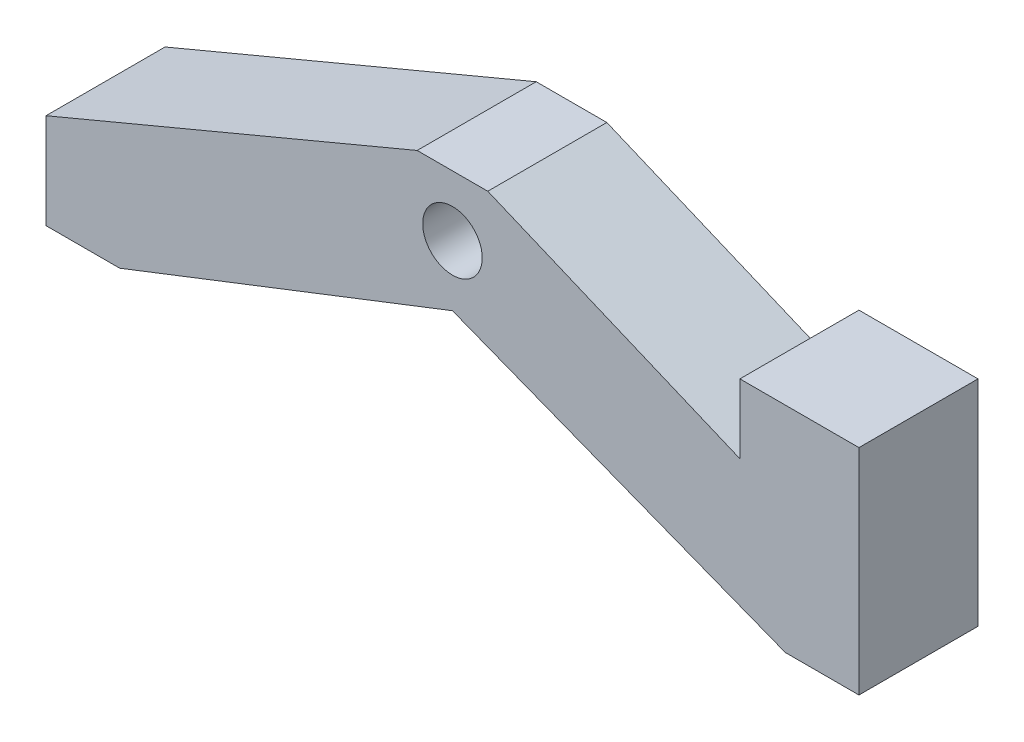
ISO-10303-21;
HEADER;
FILE_DESCRIPTION(('STEP AP214'),'2;1');
FILE_NAME('part.step','',(''),(''),'','','');
FILE_SCHEMA(('AUTOMOTIVE_DESIGN { 1 0 10303 214 1 1 1 1 }'));
ENDSEC;
DATA;
#1=APPLICATION_CONTEXT('core data for automotive mechanical design processes');
#2=APPLICATION_PROTOCOL_DEFINITION('international standard','automotive_design',2000,#1);
#3=PRODUCT_CONTEXT('',#1,'mechanical');
#4=PRODUCT('Part','Part','',(#3));
#5=PRODUCT_RELATED_PRODUCT_CATEGORY('part','',(#4));
#6=PRODUCT_DEFINITION_FORMATION('','',#4);
#7=PRODUCT_DEFINITION_CONTEXT('part definition',#1,'design');
#8=PRODUCT_DEFINITION('design','',#6,#7);
#9=PRODUCT_DEFINITION_SHAPE('','',#8);
#10=(LENGTH_UNIT() NAMED_UNIT(*) SI_UNIT(.MILLI.,.METRE.));
#11=(NAMED_UNIT(*) PLANE_ANGLE_UNIT() SI_UNIT($,.RADIAN.));
#12=(NAMED_UNIT(*) SI_UNIT($,.STERADIAN.) SOLID_ANGLE_UNIT());
#13=UNCERTAINTY_MEASURE_WITH_UNIT(LENGTH_MEASURE(1.E-05),#10,'distance_accuracy_value','');
#14=(GEOMETRIC_REPRESENTATION_CONTEXT(3) GLOBAL_UNCERTAINTY_ASSIGNED_CONTEXT((#13)) GLOBAL_UNIT_ASSIGNED_CONTEXT((#10,
#11,#12)) REPRESENTATION_CONTEXT('',''));
#15=CARTESIAN_POINT('',(0.,0.,0.));
#16=DIRECTION('',(0.,0.,1.));
#17=DIRECTION('',(1.,0.,0.));
#18=AXIS2_PLACEMENT_3D('',#15,#16,#17);
#19=CARTESIAN_POINT('',(34.1438780120931,-2.88405172877399,5.));
#20=DIRECTION('',(-0.386383553202414,-0.922338197091868,0.));
#21=DIRECTION('',(0.922338197091868,-0.386383553202414,0.));
#22=AXIS2_PLACEMENT_3D('',#19,#20,#21);
#23=PLANE('',#22);
#24=DIRECTION('',(0.,0.,1.));
#25=VECTOR('',#24,1.);
#26=CARTESIAN_POINT('',(24.1438780120931,1.30512263720891,-5.));
#27=LINE('',#26,#25);
#28=CARTESIAN_POINT('',(24.1438780120931,1.30512263720891,-5.));
#29=VERTEX_POINT('',#28);
#30=CARTESIAN_POINT('',(24.1438780120931,1.30512263720891,5.));
#31=VERTEX_POINT('',#30);
#32=EDGE_CURVE('E77',#29,#31,#27,.T.);
#33=ORIENTED_EDGE('',*,*,#32,.F.);
#34=DIRECTION('',(-0.922338197091868,0.386383553202414,0.));
#35=VECTOR('',#34,1.);
#36=CARTESIAN_POINT('',(34.1438780120931,-2.88405172877399,-5.));
#37=LINE('',#36,#35);
#38=CARTESIAN_POINT('',(2.96622663641541,10.17681006468,-5.));
#39=VERTEX_POINT('',#38);
#40=EDGE_CURVE('E175',#29,#39,#37,.T.);
#41=ORIENTED_EDGE('',*,*,#40,.T.);
#42=DIRECTION('',(0.,0.,-1.));
#43=VECTOR('',#42,1.);
#44=CARTESIAN_POINT('',(2.96622663641541,10.17681006468,5.));
#45=LINE('',#44,#43);
#46=CARTESIAN_POINT('',(2.96622663641541,10.17681006468,5.));
#47=VERTEX_POINT('',#46);
#48=EDGE_CURVE('E12',#47,#39,#45,.T.);
#49=ORIENTED_EDGE('',*,*,#48,.F.);
#50=DIRECTION('',(-0.922338197091868,0.386383553202414,0.));
#51=VECTOR('',#50,1.);
#52=CARTESIAN_POINT('',(34.1438780120931,-2.88405172877399,5.));
#53=LINE('',#52,#51);
#54=EDGE_CURVE('E125',#31,#47,#53,.T.);
#55=ORIENTED_EDGE('',*,*,#54,.F.);
#56=EDGE_LOOP('',(#33,#41,#49,#55));
#57=FACE_BOUND('',#56,.T.);
#58=ADVANCED_FACE('F63',(#57),#23,.F.);
#59=CARTESIAN_POINT('',(0.,0.,5.));
#60=DIRECTION('',(0.,0.,-1.));
#61=DIRECTION('',(-1.,0.,0.));
#62=AXIS2_PLACEMENT_3D('',#59,#60,#61);
#63=PLANE('',#62);
#64=DIRECTION('',(0.,1.,0.));
#65=VECTOR('',#64,1.);
#66=CARTESIAN_POINT('',(34.1438780120931,-10.884051728774,5.));
#67=LINE('',#66,#65);
#68=CARTESIAN_POINT('',(34.1438780120931,-10.884051728774,5.));
#69=VERTEX_POINT('',#68);
#70=CARTESIAN_POINT('',(34.1438780120931,7.11594827122601,5.));
#71=VERTEX_POINT('',#70);
#72=EDGE_CURVE('E172',#69,#71,#67,.T.);
#73=ORIENTED_EDGE('',*,*,#72,.T.);
#74=DIRECTION('',(-1.,0.,0.));
#75=VECTOR('',#74,1.);
#76=CARTESIAN_POINT('',(24.1438780120931,7.11594827122601,5.));
#77=LINE('',#76,#75);
#78=CARTESIAN_POINT('',(24.1438780120931,7.11594827122601,5.));
#79=VERTEX_POINT('',#78);
#80=EDGE_CURVE('E243',#71,#79,#77,.T.);
#81=ORIENTED_EDGE('',*,*,#80,.T.);
#82=DIRECTION('',(0.,-1.,0.));
#83=VECTOR('',#82,1.);
#84=CARTESIAN_POINT('',(24.1438780120931,1.30512263720891,5.));
#85=LINE('',#84,#83);
#86=EDGE_CURVE('E240',#79,#31,#85,.T.);
#87=ORIENTED_EDGE('',*,*,#86,.T.);
#88=ORIENTED_EDGE('',*,*,#54,.T.);
#89=DIRECTION('',(-1.,0.,0.));
#90=VECTOR('',#89,1.);
#91=CARTESIAN_POINT('',(2.96622663641541,10.17681006468,5.));
#92=LINE('',#91,#90);
#93=CARTESIAN_POINT('',(-2.96622663641544,10.17681006468,5.));
#94=VERTEX_POINT('',#93);
#95=EDGE_CURVE('E222',#47,#94,#92,.T.);
#96=ORIENTED_EDGE('',*,*,#95,.T.);
#97=DIRECTION('',(0.922338197091867,0.386383553202416,0.));
#98=VECTOR('',#97,1.);
#99=CARTESIAN_POINT('',(-34.143878012093,-2.88405172877408,5.));
#100=LINE('',#99,#98);
#101=CARTESIAN_POINT('',(-34.143878012093,-2.88405172877408,5.));
#102=VERTEX_POINT('',#101);
#103=EDGE_CURVE('E209',#102,#94,#100,.T.);
#104=ORIENTED_EDGE('',*,*,#103,.F.);
#105=DIRECTION('',(0.,1.,0.));
#106=VECTOR('',#105,1.);
#107=CARTESIAN_POINT('',(-34.143878012093,-10.8840517287741,5.));
#108=LINE('',#107,#106);
#109=CARTESIAN_POINT('',(-34.143878012093,-10.8840517287741,5.));
#110=VERTEX_POINT('',#109);
#111=EDGE_CURVE('E167',#110,#102,#108,.T.);
#112=ORIENTED_EDGE('',*,*,#111,.F.);
#113=DIRECTION('',(-1.,0.,0.));
#114=VECTOR('',#113,1.);
#115=CARTESIAN_POINT('',(-27.9559907348205,-10.8840517287741,5.));
#116=LINE('',#115,#114);
#117=CARTESIAN_POINT('',(-27.9559907348205,-10.8840517287741,5.));
#118=VERTEX_POINT('',#117);
#119=EDGE_CURVE('E165',#118,#110,#116,.T.);
#120=ORIENTED_EDGE('',*,*,#119,.F.);
#121=DIRECTION('',(-0.93186635782735,-0.362801724292469,0.));
#122=VECTOR('',#121,1.);
#123=CARTESIAN_POINT('',(0.,0.,5.));
#124=LINE('',#123,#122);
#125=CARTESIAN_POINT('',(0.,0.,5.));
#126=VERTEX_POINT('',#125);
#127=EDGE_CURVE('E148',#126,#118,#124,.T.);
#128=ORIENTED_EDGE('',*,*,#127,.F.);
#129=DIRECTION('',(0.931866357827351,-0.362801724292466,0.));
#130=VECTOR('',#129,1.);
#131=CARTESIAN_POINT('',(0.,0.,5.));
#132=LINE('',#131,#130);
#133=CARTESIAN_POINT('',(27.9559907348205,-10.884051728774,5.));
#134=VERTEX_POINT('',#133);
#135=EDGE_CURVE('E157',#126,#134,#132,.T.);
#136=ORIENTED_EDGE('',*,*,#135,.T.);
#137=DIRECTION('',(1.,0.,0.));
#138=VECTOR('',#137,1.);
#139=CARTESIAN_POINT('',(27.9559907348205,-10.884051728774,5.));
#140=LINE('',#139,#138);
#141=EDGE_CURVE('E86',#134,#69,#140,.T.);
#142=ORIENTED_EDGE('',*,*,#141,.T.);
#143=EDGE_LOOP('',(#73,#81,#87,#88,#96,#104,#112,#120,#128,#136,#142));
#144=FACE_BOUND('',#143,.T.);
#145=CARTESIAN_POINT('',(0.,5.08840503234002,5.));
#146=DIRECTION('',(0.,0.,1.));
#147=DIRECTION('',(1.,0.,0.));
#148=AXIS2_PLACEMENT_3D('',#145,#146,#147);
#149=CIRCLE('',#148,2.5);
#150=CARTESIAN_POINT('',(2.49999999999999,5.08840503234002,5.));
#151=VERTEX_POINT('',#150);
#152=EDGE_CURVE('E178',#151,#151,#149,.T.);
#153=ORIENTED_EDGE('',*,*,#152,.F.);
#154=EDGE_LOOP('',(#153));
#155=FACE_BOUND('',#154,.T.);
#156=ADVANCED_FACE('F161',(#144,#155),#63,.F.);
#157=CARTESIAN_POINT('',(0.,0.,-5.));
#158=DIRECTION('',(0.,0.,-1.));
#159=DIRECTION('',(-1.,0.,0.));
#160=AXIS2_PLACEMENT_3D('',#157,#158,#159);
#161=PLANE('',#160);
#162=ORIENTED_EDGE('',*,*,#40,.F.);
#163=DIRECTION('',(0.,-1.,0.));
#164=VECTOR('',#163,1.);
#165=CARTESIAN_POINT('',(24.1438780120931,1.30512263720891,-5.));
#166=LINE('',#165,#164);
#167=CARTESIAN_POINT('',(24.1438780120931,7.11594827122601,-5.));
#168=VERTEX_POINT('',#167);
#169=EDGE_CURVE('E236',#168,#29,#166,.T.);
#170=ORIENTED_EDGE('',*,*,#169,.F.);
#171=DIRECTION('',(-1.,0.,0.));
#172=VECTOR('',#171,1.);
#173=CARTESIAN_POINT('',(24.1438780120931,7.11594827122601,-5.));
#174=LINE('',#173,#172);
#175=CARTESIAN_POINT('',(34.1438780120931,7.11594827122601,-5.));
#176=VERTEX_POINT('',#175);
#177=EDGE_CURVE('E242',#176,#168,#174,.T.);
#178=ORIENTED_EDGE('',*,*,#177,.F.);
#179=DIRECTION('',(0.,1.,0.));
#180=VECTOR('',#179,1.);
#181=CARTESIAN_POINT('',(34.1438780120931,-10.884051728774,-5.));
#182=LINE('',#181,#180);
#183=CARTESIAN_POINT('',(34.1438780120931,-10.884051728774,-5.));
#184=VERTEX_POINT('',#183);
#185=EDGE_CURVE('E194',#184,#176,#182,.T.);
#186=ORIENTED_EDGE('',*,*,#185,.F.);
#187=DIRECTION('',(1.,0.,0.));
#188=VECTOR('',#187,1.);
#189=CARTESIAN_POINT('',(27.9559907348205,-10.884051728774,-5.));
#190=LINE('',#189,#188);
#191=CARTESIAN_POINT('',(27.9559907348205,-10.884051728774,-5.));
#192=VERTEX_POINT('',#191);
#193=EDGE_CURVE('E118',#192,#184,#190,.T.);
#194=ORIENTED_EDGE('',*,*,#193,.F.);
#195=DIRECTION('',(0.931866357827351,-0.362801724292466,0.));
#196=VECTOR('',#195,1.);
#197=CARTESIAN_POINT('',(0.,0.,-5.));
#198=LINE('',#197,#196);
#199=CARTESIAN_POINT('',(0.,0.,-5.));
#200=VERTEX_POINT('',#199);
#201=EDGE_CURVE('E191',#200,#192,#198,.T.);
#202=ORIENTED_EDGE('',*,*,#201,.F.);
#203=DIRECTION('',(-0.93186635782735,-0.362801724292469,0.));
#204=VECTOR('',#203,1.);
#205=CARTESIAN_POINT('',(0.,0.,-5.));
#206=LINE('',#205,#204);
#207=CARTESIAN_POINT('',(-27.9559907348205,-10.8840517287741,-5.));
#208=VERTEX_POINT('',#207);
#209=EDGE_CURVE('E150',#200,#208,#206,.T.);
#210=ORIENTED_EDGE('',*,*,#209,.T.);
#211=DIRECTION('',(-1.,0.,0.));
#212=VECTOR('',#211,1.);
#213=CARTESIAN_POINT('',(-27.9559907348205,-10.8840517287741,-5.));
#214=LINE('',#213,#212);
#215=CARTESIAN_POINT('',(-34.143878012093,-10.8840517287741,-5.));
#216=VERTEX_POINT('',#215);
#217=EDGE_CURVE('E187',#208,#216,#214,.T.);
#218=ORIENTED_EDGE('',*,*,#217,.T.);
#219=DIRECTION('',(0.,1.,0.));
#220=VECTOR('',#219,1.);
#221=CARTESIAN_POINT('',(-34.143878012093,-10.8840517287741,-5.));
#222=LINE('',#221,#220);
#223=CARTESIAN_POINT('',(-34.143878012093,-2.88405172877408,-5.));
#224=VERTEX_POINT('',#223);
#225=EDGE_CURVE('E184',#216,#224,#222,.T.);
#226=ORIENTED_EDGE('',*,*,#225,.T.);
#227=DIRECTION('',(0.922338197091867,0.386383553202416,0.));
#228=VECTOR('',#227,1.);
#229=CARTESIAN_POINT('',(-34.143878012093,-2.88405172877408,-5.));
#230=LINE('',#229,#228);
#231=CARTESIAN_POINT('',(-2.96622663641544,10.17681006468,-5.));
#232=VERTEX_POINT('',#231);
#233=EDGE_CURVE('E181',#224,#232,#230,.T.);
#234=ORIENTED_EDGE('',*,*,#233,.T.);
#235=DIRECTION('',(-1.,0.,0.));
#236=VECTOR('',#235,1.);
#237=CARTESIAN_POINT('',(2.96622663641541,10.17681006468,-5.));
#238=LINE('',#237,#236);
#239=EDGE_CURVE('E177',#39,#232,#238,.T.);
#240=ORIENTED_EDGE('',*,*,#239,.F.);
#241=EDGE_LOOP('',(#162,#170,#178,#186,#194,#202,#210,#218,#226,#234,#240));
#242=FACE_BOUND('',#241,.T.);
#243=CARTESIAN_POINT('',(0.,5.08840503234002,-5.));
#244=DIRECTION('',(0.,0.,1.));
#245=DIRECTION('',(1.,0.,0.));
#246=AXIS2_PLACEMENT_3D('',#243,#244,#245);
#247=CIRCLE('',#246,2.5);
#248=CARTESIAN_POINT('',(2.49999999999999,5.08840503234002,-5.));
#249=VERTEX_POINT('',#248);
#250=EDGE_CURVE('E227',#249,#249,#247,.T.);
#251=ORIENTED_EDGE('',*,*,#250,.T.);
#252=EDGE_LOOP('',(#251));
#253=FACE_BOUND('',#252,.T.);
#254=ADVANCED_FACE('F215',(#242,#253),#161,.T.);
#255=CARTESIAN_POINT('',(2.96622663641541,10.17681006468,5.));
#256=DIRECTION('',(0.,-1.,0.));
#257=DIRECTION('',(1.,0.,0.));
#258=AXIS2_PLACEMENT_3D('',#255,#256,#257);
#259=PLANE('',#258);
#260=ORIENTED_EDGE('',*,*,#239,.T.);
#261=DIRECTION('',(0.,0.,-1.));
#262=VECTOR('',#261,1.);
#263=CARTESIAN_POINT('',(-2.96622663641544,10.17681006468,5.));
#264=LINE('',#263,#262);
#265=EDGE_CURVE('E70',#94,#232,#264,.T.);
#266=ORIENTED_EDGE('',*,*,#265,.F.);
#267=ORIENTED_EDGE('',*,*,#95,.F.);
#268=ORIENTED_EDGE('',*,*,#48,.T.);
#269=EDGE_LOOP('',(#260,#266,#267,#268));
#270=FACE_BOUND('',#269,.T.);
#271=ADVANCED_FACE('F212',(#270),#259,.F.);
#272=CARTESIAN_POINT('',(-34.143878012093,-2.88405172877408,5.));
#273=DIRECTION('',(-0.386383553202416,0.922338197091867,0.));
#274=DIRECTION('',(-0.922338197091867,-0.386383553202416,0.));
#275=AXIS2_PLACEMENT_3D('',#272,#273,#274);
#276=PLANE('',#275);
#277=ORIENTED_EDGE('',*,*,#233,.F.);
#278=DIRECTION('',(0.,0.,-1.));
#279=VECTOR('',#278,1.);
#280=CARTESIAN_POINT('',(-34.143878012093,-2.88405172877408,5.));
#281=LINE('',#280,#279);
#282=EDGE_CURVE('E202',#102,#224,#281,.T.);
#283=ORIENTED_EDGE('',*,*,#282,.F.);
#284=ORIENTED_EDGE('',*,*,#103,.T.);
#285=ORIENTED_EDGE('',*,*,#265,.T.);
#286=EDGE_LOOP('',(#277,#283,#284,#285));
#287=FACE_BOUND('',#286,.T.);
#288=ADVANCED_FACE('F207',(#287),#276,.T.);
#289=CARTESIAN_POINT('',(-34.143878012093,-10.8840517287741,5.));
#290=DIRECTION('',(-1.,0.,0.));
#291=DIRECTION('',(0.,-1.,0.));
#292=AXIS2_PLACEMENT_3D('',#289,#290,#291);
#293=PLANE('',#292);
#294=ORIENTED_EDGE('',*,*,#225,.F.);
#295=DIRECTION('',(0.,0.,-1.));
#296=VECTOR('',#295,1.);
#297=CARTESIAN_POINT('',(-34.143878012093,-10.8840517287741,5.));
#298=LINE('',#297,#296);
#299=EDGE_CURVE('E200',#110,#216,#298,.T.);
#300=ORIENTED_EDGE('',*,*,#299,.F.);
#301=ORIENTED_EDGE('',*,*,#111,.T.);
#302=ORIENTED_EDGE('',*,*,#282,.T.);
#303=EDGE_LOOP('',(#294,#300,#301,#302));
#304=FACE_BOUND('',#303,.T.);
#305=ADVANCED_FACE('F220',(#304),#293,.T.);
#306=CARTESIAN_POINT('',(-27.9559907348205,-10.8840517287741,5.));
#307=DIRECTION('',(0.,-1.,0.));
#308=DIRECTION('',(1.,0.,0.));
#309=AXIS2_PLACEMENT_3D('',#306,#307,#308);
#310=PLANE('',#309);
#311=ORIENTED_EDGE('',*,*,#217,.F.);
#312=DIRECTION('',(0.,0.,-1.));
#313=VECTOR('',#312,1.);
#314=CARTESIAN_POINT('',(-27.9559907348205,-10.8840517287741,5.));
#315=LINE('',#314,#313);
#316=EDGE_CURVE('E153',#118,#208,#315,.T.);
#317=ORIENTED_EDGE('',*,*,#316,.F.);
#318=ORIENTED_EDGE('',*,*,#119,.T.);
#319=ORIENTED_EDGE('',*,*,#299,.T.);
#320=EDGE_LOOP('',(#311,#317,#318,#319));
#321=FACE_BOUND('',#320,.T.);
#322=ADVANCED_FACE('F357',(#321),#310,.T.);
#323=CARTESIAN_POINT('',(0.,0.,5.));
#324=DIRECTION('',(0.362801724292469,-0.93186635782735,0.));
#325=DIRECTION('',(0.93186635782735,0.362801724292469,0.));
#326=AXIS2_PLACEMENT_3D('',#323,#324,#325);
#327=PLANE('',#326);
#328=ORIENTED_EDGE('',*,*,#209,.F.);
#329=DIRECTION('',(0.,0.,-1.));
#330=VECTOR('',#329,1.);
#331=CARTESIAN_POINT('',(0.,0.,5.));
#332=LINE('',#331,#330);
#333=EDGE_CURVE('E144',#126,#200,#332,.T.);
#334=ORIENTED_EDGE('',*,*,#333,.F.);
#335=ORIENTED_EDGE('',*,*,#127,.T.);
#336=ORIENTED_EDGE('',*,*,#316,.T.);
#337=EDGE_LOOP('',(#328,#334,#335,#336));
#338=FACE_BOUND('',#337,.T.);
#339=ADVANCED_FACE('F146',(#338),#327,.T.);
#340=CARTESIAN_POINT('',(0.,0.,5.));
#341=DIRECTION('',(0.362801724292466,0.931866357827351,0.));
#342=DIRECTION('',(-0.931866357827351,0.362801724292466,0.));
#343=AXIS2_PLACEMENT_3D('',#340,#341,#342);
#344=PLANE('',#343);
#345=ORIENTED_EDGE('',*,*,#201,.T.);
#346=DIRECTION('',(0.,0.,-1.));
#347=VECTOR('',#346,1.);
#348=CARTESIAN_POINT('',(27.9559907348205,-10.884051728774,5.));
#349=LINE('',#348,#347);
#350=EDGE_CURVE('E154',#134,#192,#349,.T.);
#351=ORIENTED_EDGE('',*,*,#350,.F.);
#352=ORIENTED_EDGE('',*,*,#135,.F.);
#353=ORIENTED_EDGE('',*,*,#333,.T.);
#354=EDGE_LOOP('',(#345,#351,#352,#353));
#355=FACE_BOUND('',#354,.T.);
#356=ADVANCED_FACE('F158',(#355),#344,.F.);
#357=CARTESIAN_POINT('',(27.9559907348205,-10.884051728774,5.));
#358=DIRECTION('',(0.,1.,0.));
#359=DIRECTION('',(0.,0.,1.));
#360=AXIS2_PLACEMENT_3D('',#357,#358,#359);
#361=PLANE('',#360);
#362=ORIENTED_EDGE('',*,*,#193,.T.);
#363=DIRECTION('',(0.,0.,-1.));
#364=VECTOR('',#363,1.);
#365=CARTESIAN_POINT('',(34.1438780120931,-10.884051728774,5.));
#366=LINE('',#365,#364);
#367=EDGE_CURVE('E174',#69,#184,#366,.T.);
#368=ORIENTED_EDGE('',*,*,#367,.F.);
#369=ORIENTED_EDGE('',*,*,#141,.F.);
#370=ORIENTED_EDGE('',*,*,#350,.T.);
#371=EDGE_LOOP('',(#362,#368,#369,#370));
#372=FACE_BOUND('',#371,.T.);
#373=ADVANCED_FACE('F269',(#372),#361,.F.);
#374=CARTESIAN_POINT('',(34.1438780120931,-10.884051728774,5.));
#375=DIRECTION('',(-1.,0.,0.));
#376=DIRECTION('',(0.,0.,1.));
#377=AXIS2_PLACEMENT_3D('',#374,#375,#376);
#378=PLANE('',#377);
#379=ORIENTED_EDGE('',*,*,#185,.T.);
#380=DIRECTION('',(0.,0.,1.));
#381=VECTOR('',#380,1.);
#382=CARTESIAN_POINT('',(34.1438780120931,7.11594827122601,-5.));
#383=LINE('',#382,#381);
#384=EDGE_CURVE('E232',#176,#71,#383,.T.);
#385=ORIENTED_EDGE('',*,*,#384,.T.);
#386=ORIENTED_EDGE('',*,*,#72,.F.);
#387=ORIENTED_EDGE('',*,*,#367,.T.);
#388=EDGE_LOOP('',(#379,#385,#386,#387));
#389=FACE_BOUND('',#388,.T.);
#390=ADVANCED_FACE('F266',(#389),#378,.F.);
#391=CARTESIAN_POINT('',(0.,5.08840503234002,5.));
#392=DIRECTION('',(0.,0.,-1.));
#393=DIRECTION('',(-1.,0.,0.));
#394=AXIS2_PLACEMENT_3D('',#391,#392,#393);
#395=CYLINDRICAL_SURFACE('',#394,2.5);
#396=ORIENTED_EDGE('',*,*,#152,.T.);
#397=EDGE_LOOP('',(#396));
#398=FACE_BOUND('',#397,.T.);
#399=ORIENTED_EDGE('',*,*,#250,.F.);
#400=EDGE_LOOP('',(#399));
#401=FACE_BOUND('',#400,.T.);
#402=ADVANCED_FACE('F268',(#398,#401),#395,.F.);
#403=CARTESIAN_POINT('',(24.1438780120931,1.30512263720891,-5.));
#404=DIRECTION('',(-1.,0.,0.));
#405=DIRECTION('',(0.,0.,1.));
#406=AXIS2_PLACEMENT_3D('',#403,#404,#405);
#407=PLANE('',#406);
#408=ORIENTED_EDGE('',*,*,#86,.F.);
#409=DIRECTION('',(0.,0.,1.));
#410=VECTOR('',#409,1.);
#411=CARTESIAN_POINT('',(24.1438780120931,7.11594827122601,-5.));
#412=LINE('',#411,#410);
#413=EDGE_CURVE('E235',#168,#79,#412,.T.);
#414=ORIENTED_EDGE('',*,*,#413,.F.);
#415=ORIENTED_EDGE('',*,*,#169,.T.);
#416=ORIENTED_EDGE('',*,*,#32,.T.);
#417=EDGE_LOOP('',(#408,#414,#415,#416));
#418=FACE_BOUND('',#417,.T.);
#419=ADVANCED_FACE('F275',(#418),#407,.T.);
#420=CARTESIAN_POINT('',(24.1438780120931,7.11594827122601,-5.));
#421=DIRECTION('',(0.,1.,0.));
#422=DIRECTION('',(0.,0.,1.));
#423=AXIS2_PLACEMENT_3D('',#420,#421,#422);
#424=PLANE('',#423);
#425=ORIENTED_EDGE('',*,*,#80,.F.);
#426=ORIENTED_EDGE('',*,*,#384,.F.);
#427=ORIENTED_EDGE('',*,*,#177,.T.);
#428=ORIENTED_EDGE('',*,*,#413,.T.);
#429=EDGE_LOOP('',(#425,#426,#427,#428));
#430=FACE_BOUND('',#429,.T.);
#431=ADVANCED_FACE('F253',(#430),#424,.T.);
#432=CLOSED_SHELL('',(#58,#156,#254,#271,#288,#305,#322,#339,#356,#373,#390,#402,#419,#431));
#433=MANIFOLD_SOLID_BREP('B2',#432);
#434=ADVANCED_BREP_SHAPE_REPRESENTATION('',(#18,#433),#14);
#435=SHAPE_DEFINITION_REPRESENTATION(#9,#434);
ENDSEC;
END-ISO-10303-21;
